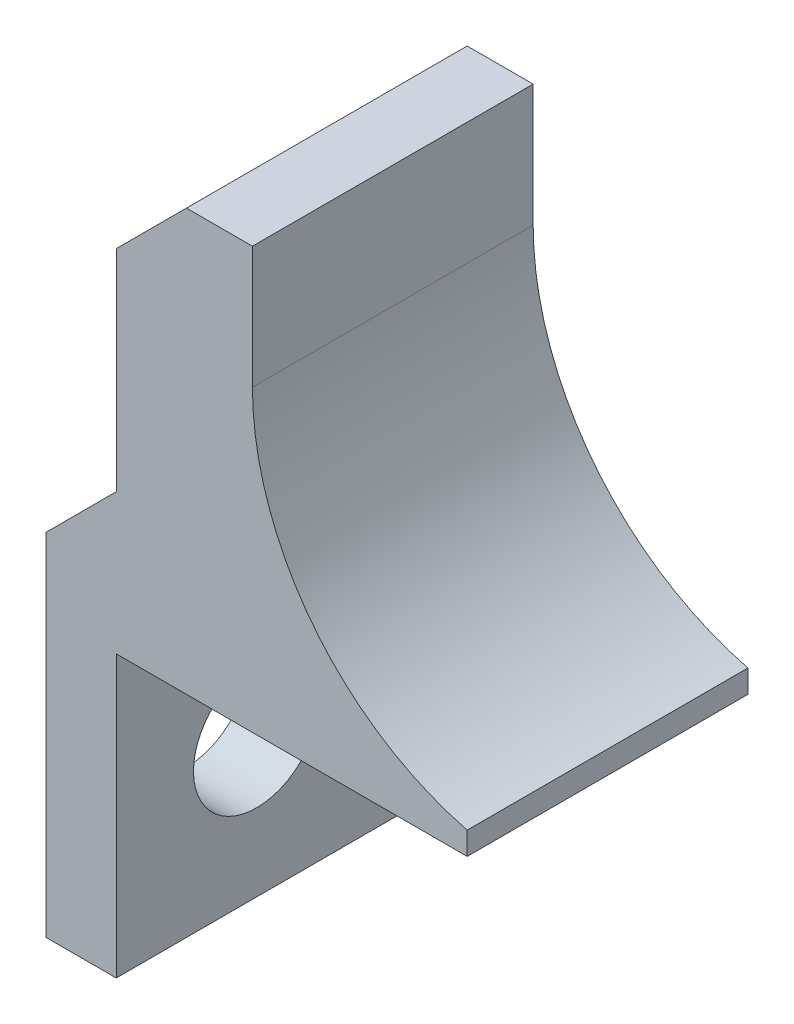
ISO-10303-21;
HEADER;
FILE_DESCRIPTION(('STEP AP214'),'2;1');
FILE_NAME('part.step','',(''),(''),'','','');
FILE_SCHEMA(('AUTOMOTIVE_DESIGN { 1 0 10303 214 1 1 1 1 }'));
ENDSEC;
DATA;
#1=APPLICATION_CONTEXT('core data for automotive mechanical design processes');
#2=APPLICATION_PROTOCOL_DEFINITION('international standard','automotive_design',2000,#1);
#3=PRODUCT_CONTEXT('',#1,'mechanical');
#4=PRODUCT('Part','Part','',(#3));
#5=PRODUCT_RELATED_PRODUCT_CATEGORY('part','',(#4));
#6=PRODUCT_DEFINITION_FORMATION('','',#4);
#7=PRODUCT_DEFINITION_CONTEXT('part definition',#1,'design');
#8=PRODUCT_DEFINITION('design','',#6,#7);
#9=PRODUCT_DEFINITION_SHAPE('','',#8);
#10=(LENGTH_UNIT() NAMED_UNIT(*) SI_UNIT(.MILLI.,.METRE.));
#11=(NAMED_UNIT(*) PLANE_ANGLE_UNIT() SI_UNIT($,.RADIAN.));
#12=(NAMED_UNIT(*) SI_UNIT($,.STERADIAN.) SOLID_ANGLE_UNIT());
#13=UNCERTAINTY_MEASURE_WITH_UNIT(LENGTH_MEASURE(1.E-05),#10,'distance_accuracy_value','');
#14=(GEOMETRIC_REPRESENTATION_CONTEXT(3) GLOBAL_UNCERTAINTY_ASSIGNED_CONTEXT((#13)) GLOBAL_UNIT_ASSIGNED_CONTEXT((#10,
#11,#12)) REPRESENTATION_CONTEXT('',''));
#15=CARTESIAN_POINT('',(0.,0.,0.));
#16=DIRECTION('',(0.,0.,1.));
#17=DIRECTION('',(1.,0.,0.));
#18=AXIS2_PLACEMENT_3D('',#15,#16,#17);
#19=CARTESIAN_POINT('',(0.,0.,20.));
#20=DIRECTION('',(-1.,0.,0.));
#21=DIRECTION('',(0.,0.,1.));
#22=AXIS2_PLACEMENT_3D('',#19,#20,#21);
#23=PLANE('',#22);
#24=CARTESIAN_POINT('',(0.,-10.,10.));
#25=DIRECTION('',(-1.,0.,0.));
#26=DIRECTION('',(0.,0.,1.));
#27=AXIS2_PLACEMENT_3D('',#24,#25,#26);
#28=CIRCLE('',#27,4.5);
#29=CARTESIAN_POINT('',(0.,-10.,14.5));
#30=VERTEX_POINT('',#29);
#31=EDGE_CURVE('E243',#30,#30,#28,.T.);
#32=ORIENTED_EDGE('',*,*,#31,.T.);
#33=EDGE_LOOP('',(#32));
#34=FACE_BOUND('',#33,.T.);
#35=DIRECTION('',(0.,1.,0.));
#36=VECTOR('',#35,1.);
#37=CARTESIAN_POINT('',(0.,0.,0.));
#38=LINE('',#37,#36);
#39=CARTESIAN_POINT('',(0.,-20.,0.));
#40=VERTEX_POINT('',#39);
#41=CARTESIAN_POINT('',(0.,0.,0.));
#42=VERTEX_POINT('',#41);
#43=EDGE_CURVE('E151',#40,#42,#38,.T.);
#44=ORIENTED_EDGE('',*,*,#43,.T.);
#45=DIRECTION('',(0.,0.,-1.));
#46=VECTOR('',#45,1.);
#47=CARTESIAN_POINT('',(0.,0.,20.));
#48=LINE('',#47,#46);
#49=CARTESIAN_POINT('',(0.,0.,20.));
#50=VERTEX_POINT('',#49);
#51=EDGE_CURVE('E130',#50,#42,#48,.T.);
#52=ORIENTED_EDGE('',*,*,#51,.F.);
#53=DIRECTION('',(0.,1.,0.));
#54=VECTOR('',#53,1.);
#55=CARTESIAN_POINT('',(0.,0.,20.));
#56=LINE('',#55,#54);
#57=CARTESIAN_POINT('',(0.,-20.,20.));
#58=VERTEX_POINT('',#57);
#59=EDGE_CURVE('E138',#58,#50,#56,.T.);
#60=ORIENTED_EDGE('',*,*,#59,.F.);
#61=DIRECTION('',(0.,0.,-1.));
#62=VECTOR('',#61,1.);
#63=CARTESIAN_POINT('',(0.,-20.,20.));
#64=LINE('',#63,#62);
#65=EDGE_CURVE('E200',#58,#40,#64,.T.);
#66=ORIENTED_EDGE('',*,*,#65,.T.);
#67=EDGE_LOOP('',(#44,#52,#60,#66));
#68=FACE_BOUND('',#67,.T.);
#69=ADVANCED_FACE('F41',(#34,#68),#23,.F.);
#70=CARTESIAN_POINT('',(6.25,0.,20.));
#71=DIRECTION('',(0.,1.,0.));
#72=DIRECTION('',(0.,0.,1.));
#73=AXIS2_PLACEMENT_3D('',#70,#71,#72);
#74=PLANE('',#73);
#75=DIRECTION('',(1.,0.,0.));
#76=VECTOR('',#75,1.);
#77=CARTESIAN_POINT('',(6.25,0.,0.));
#78=LINE('',#77,#76);
#79=CARTESIAN_POINT('',(25.,0.,0.));
#80=VERTEX_POINT('',#79);
#81=EDGE_CURVE('E236',#42,#80,#78,.T.);
#82=ORIENTED_EDGE('',*,*,#81,.T.);
#83=DIRECTION('',(0.,0.,-1.));
#84=VECTOR('',#83,1.);
#85=CARTESIAN_POINT('',(25.,0.,20.));
#86=LINE('',#85,#84);
#87=CARTESIAN_POINT('',(25.,0.,20.));
#88=VERTEX_POINT('',#87);
#89=EDGE_CURVE('E133',#88,#80,#86,.T.);
#90=ORIENTED_EDGE('',*,*,#89,.F.);
#91=DIRECTION('',(1.,0.,0.));
#92=VECTOR('',#91,1.);
#93=CARTESIAN_POINT('',(0.,0.,20.));
#94=LINE('',#93,#92);
#95=EDGE_CURVE('E126',#50,#88,#94,.T.);
#96=ORIENTED_EDGE('',*,*,#95,.F.);
#97=ORIENTED_EDGE('',*,*,#51,.T.);
#98=EDGE_LOOP('',(#82,#90,#96,#97));
#99=FACE_BOUND('',#98,.T.);
#100=ADVANCED_FACE('F128',(#99),#74,.F.);
#101=CARTESIAN_POINT('',(25.,0.,20.));
#102=DIRECTION('',(-1.,0.,0.));
#103=DIRECTION('',(0.,0.,1.));
#104=AXIS2_PLACEMENT_3D('',#101,#102,#103);
#105=PLANE('',#104);
#106=DIRECTION('',(0.,1.,0.));
#107=VECTOR('',#106,1.);
#108=CARTESIAN_POINT('',(25.,0.,0.));
#109=LINE('',#108,#107);
#110=CARTESIAN_POINT('',(25.,1.62539708151648,0.));
#111=VERTEX_POINT('',#110);
#112=EDGE_CURVE('E231',#80,#111,#109,.T.);
#113=ORIENTED_EDGE('',*,*,#112,.T.);
#114=DIRECTION('',(0.,0.,-1.));
#115=VECTOR('',#114,1.);
#116=CARTESIAN_POINT('',(25.,1.62539708151648,20.));
#117=LINE('',#116,#115);
#118=CARTESIAN_POINT('',(25.,1.62539708151648,20.));
#119=VERTEX_POINT('',#118);
#120=EDGE_CURVE('E160',#119,#111,#117,.T.);
#121=ORIENTED_EDGE('',*,*,#120,.F.);
#122=DIRECTION('',(0.,1.,0.));
#123=VECTOR('',#122,1.);
#124=CARTESIAN_POINT('',(25.,0.,20.));
#125=LINE('',#124,#123);
#126=EDGE_CURVE('E137',#88,#119,#125,.T.);
#127=ORIENTED_EDGE('',*,*,#126,.F.);
#128=ORIENTED_EDGE('',*,*,#89,.T.);
#129=EDGE_LOOP('',(#113,#121,#127,#128));
#130=FACE_BOUND('',#129,.T.);
#131=ADVANCED_FACE('F282',(#130),#105,.F.);
#132=CARTESIAN_POINT('',(30.,21.3,20.));
#133=DIRECTION('',(0.,0.,-1.));
#134=DIRECTION('',(-1.,0.,0.));
#135=AXIS2_PLACEMENT_3D('',#132,#133,#134);
#136=CYLINDRICAL_SURFACE('',#135,20.3);
#137=CARTESIAN_POINT('',(30.,21.3,0.));
#138=DIRECTION('',(0.,0.,-1.));
#139=DIRECTION('',(1.,0.,0.));
#140=AXIS2_PLACEMENT_3D('',#137,#138,#139);
#141=CIRCLE('',#140,20.3);
#142=CARTESIAN_POINT('',(9.69999999999999,21.3,0.));
#143=VERTEX_POINT('',#142);
#144=EDGE_CURVE('E226',#111,#143,#141,.T.);
#145=ORIENTED_EDGE('',*,*,#144,.T.);
#146=DIRECTION('',(0.,0.,-1.));
#147=VECTOR('',#146,1.);
#148=CARTESIAN_POINT('',(9.69999999999999,21.3,20.));
#149=LINE('',#148,#147);
#150=CARTESIAN_POINT('',(9.69999999999999,21.3,20.));
#151=VERTEX_POINT('',#150);
#152=EDGE_CURVE('E215',#151,#143,#149,.T.);
#153=ORIENTED_EDGE('',*,*,#152,.F.);
#154=CARTESIAN_POINT('',(30.,21.3,20.));
#155=DIRECTION('',(0.,0.,-1.));
#156=DIRECTION('',(1.,0.,0.));
#157=AXIS2_PLACEMENT_3D('',#154,#155,#156);
#158=CIRCLE('',#157,20.3);
#159=EDGE_CURVE('E227',#119,#151,#158,.T.);
#160=ORIENTED_EDGE('',*,*,#159,.F.);
#161=ORIENTED_EDGE('',*,*,#120,.T.);
#162=EDGE_LOOP('',(#145,#153,#160,#161));
#163=FACE_BOUND('',#162,.T.);
#164=ADVANCED_FACE('F224',(#163),#136,.F.);
#165=CARTESIAN_POINT('',(9.69999999999999,30.,20.));
#166=DIRECTION('',(-1.,0.,0.));
#167=DIRECTION('',(0.,0.,1.));
#168=AXIS2_PLACEMENT_3D('',#165,#166,#167);
#169=PLANE('',#168);
#170=DIRECTION('',(0.,1.,0.));
#171=VECTOR('',#170,1.);
#172=CARTESIAN_POINT('',(9.69999999999999,30.,0.));
#173=LINE('',#172,#171);
#174=CARTESIAN_POINT('',(9.69999999999999,30.,0.));
#175=VERTEX_POINT('',#174);
#176=EDGE_CURVE('E194',#143,#175,#173,.T.);
#177=ORIENTED_EDGE('',*,*,#176,.T.);
#178=DIRECTION('',(0.,0.,-1.));
#179=VECTOR('',#178,1.);
#180=CARTESIAN_POINT('',(9.69999999999999,30.,20.));
#181=LINE('',#180,#179);
#182=CARTESIAN_POINT('',(9.69999999999999,30.,20.));
#183=VERTEX_POINT('',#182);
#184=EDGE_CURVE('E211',#183,#175,#181,.T.);
#185=ORIENTED_EDGE('',*,*,#184,.F.);
#186=DIRECTION('',(0.,1.,0.));
#187=VECTOR('',#186,1.);
#188=CARTESIAN_POINT('',(9.69999999999999,30.,20.));
#189=LINE('',#188,#187);
#190=EDGE_CURVE('E254',#151,#183,#189,.T.);
#191=ORIENTED_EDGE('',*,*,#190,.F.);
#192=ORIENTED_EDGE('',*,*,#152,.T.);
#193=EDGE_LOOP('',(#177,#185,#191,#192));
#194=FACE_BOUND('',#193,.T.);
#195=ADVANCED_FACE('F286',(#194),#169,.F.);
#196=CARTESIAN_POINT('',(0.,30.,20.));
#197=DIRECTION('',(0.,-1.,0.));
#198=DIRECTION('',(0.,0.,-1.));
#199=AXIS2_PLACEMENT_3D('',#196,#197,#198);
#200=PLANE('',#199);
#201=DIRECTION('',(-1.,0.,0.));
#202=VECTOR('',#201,1.);
#203=CARTESIAN_POINT('',(0.,30.,0.));
#204=LINE('',#203,#202);
#205=CARTESIAN_POINT('',(5.00000000000001,30.,0.));
#206=VERTEX_POINT('',#205);
#207=EDGE_CURVE('E189',#175,#206,#204,.T.);
#208=ORIENTED_EDGE('',*,*,#207,.T.);
#209=DIRECTION('',(0.,0.,1.));
#210=VECTOR('',#209,1.);
#211=CARTESIAN_POINT('',(5.00000000000001,30.,20.));
#212=LINE('',#211,#210);
#213=CARTESIAN_POINT('',(5.00000000000001,30.,20.));
#214=VERTEX_POINT('',#213);
#215=EDGE_CURVE('E51',#206,#214,#212,.T.);
#216=ORIENTED_EDGE('',*,*,#215,.T.);
#217=DIRECTION('',(-1.,0.,0.));
#218=VECTOR('',#217,1.);
#219=CARTESIAN_POINT('',(0.,30.,20.));
#220=LINE('',#219,#218);
#221=EDGE_CURVE('E251',#183,#214,#220,.T.);
#222=ORIENTED_EDGE('',*,*,#221,.F.);
#223=ORIENTED_EDGE('',*,*,#184,.T.);
#224=EDGE_LOOP('',(#208,#216,#222,#223));
#225=FACE_BOUND('',#224,.T.);
#226=ADVANCED_FACE('F287',(#225),#200,.F.);
#227=CARTESIAN_POINT('',(0.,5.,20.));
#228=DIRECTION('',(1.,0.,0.));
#229=DIRECTION('',(0.,0.,-1.));
#230=AXIS2_PLACEMENT_3D('',#227,#228,#229);
#231=PLANE('',#230);
#232=DIRECTION('',(0.,-1.,0.));
#233=VECTOR('',#232,1.);
#234=CARTESIAN_POINT('',(0.,5.,20.));
#235=LINE('',#234,#233);
#236=CARTESIAN_POINT('',(0.,25.,20.));
#237=VERTEX_POINT('',#236);
#238=CARTESIAN_POINT('',(0.,9.99999999999998,20.));
#239=VERTEX_POINT('',#238);
#240=EDGE_CURVE('E181',#237,#239,#235,.T.);
#241=ORIENTED_EDGE('',*,*,#240,.F.);
#242=DIRECTION('',(0.,0.,-1.));
#243=VECTOR('',#242,1.);
#244=CARTESIAN_POINT('',(0.,25.,20.));
#245=LINE('',#244,#243);
#246=CARTESIAN_POINT('',(0.,25.,0.));
#247=VERTEX_POINT('',#246);
#248=EDGE_CURVE('E170',#237,#247,#245,.T.);
#249=ORIENTED_EDGE('',*,*,#248,.T.);
#250=DIRECTION('',(0.,-1.,0.));
#251=VECTOR('',#250,1.);
#252=CARTESIAN_POINT('',(0.,5.,0.));
#253=LINE('',#252,#251);
#254=CARTESIAN_POINT('',(0.,9.99999999999998,0.));
#255=VERTEX_POINT('',#254);
#256=EDGE_CURVE('E180',#247,#255,#253,.T.);
#257=ORIENTED_EDGE('',*,*,#256,.T.);
#258=DIRECTION('',(0.,0.,1.));
#259=VECTOR('',#258,1.);
#260=CARTESIAN_POINT('',(0.,9.99999999999998,20.));
#261=LINE('',#260,#259);
#262=EDGE_CURVE('E153',#255,#239,#261,.T.);
#263=ORIENTED_EDGE('',*,*,#262,.T.);
#264=EDGE_LOOP('',(#241,#249,#257,#263));
#265=FACE_BOUND('',#264,.T.);
#266=ADVANCED_FACE('F179',(#265),#231,.F.);
#267=CARTESIAN_POINT('',(-5.,-20.,20.));
#268=DIRECTION('',(1.,0.,0.));
#269=DIRECTION('',(0.,0.,-1.));
#270=AXIS2_PLACEMENT_3D('',#267,#268,#269);
#271=PLANE('',#270);
#272=CARTESIAN_POINT('',(-5.,-10.,10.));
#273=DIRECTION('',(-1.,0.,0.));
#274=DIRECTION('',(0.,0.,1.));
#275=AXIS2_PLACEMENT_3D('',#272,#273,#274);
#276=CIRCLE('',#275,4.5);
#277=CARTESIAN_POINT('',(-5.,-10.,14.5));
#278=VERTEX_POINT('',#277);
#279=EDGE_CURVE('E264',#278,#278,#276,.T.);
#280=ORIENTED_EDGE('',*,*,#279,.F.);
#281=EDGE_LOOP('',(#280));
#282=FACE_BOUND('',#281,.T.);
#283=DIRECTION('',(0.,-1.,0.));
#284=VECTOR('',#283,1.);
#285=CARTESIAN_POINT('',(-5.,-20.,0.));
#286=LINE('',#285,#284);
#287=CARTESIAN_POINT('',(-5.,5.,0.));
#288=VERTEX_POINT('',#287);
#289=CARTESIAN_POINT('',(-5.,-20.,0.));
#290=VERTEX_POINT('',#289);
#291=EDGE_CURVE('E188',#288,#290,#286,.T.);
#292=ORIENTED_EDGE('',*,*,#291,.T.);
#293=DIRECTION('',(0.,0.,-1.));
#294=VECTOR('',#293,1.);
#295=CARTESIAN_POINT('',(-5.,-20.,20.));
#296=LINE('',#295,#294);
#297=CARTESIAN_POINT('',(-5.,-20.,20.));
#298=VERTEX_POINT('',#297);
#299=EDGE_CURVE('E203',#298,#290,#296,.T.);
#300=ORIENTED_EDGE('',*,*,#299,.F.);
#301=DIRECTION('',(0.,-1.,0.));
#302=VECTOR('',#301,1.);
#303=CARTESIAN_POINT('',(-5.,-20.,20.));
#304=LINE('',#303,#302);
#305=CARTESIAN_POINT('',(-5.,5.,20.));
#306=VERTEX_POINT('',#305);
#307=EDGE_CURVE('E246',#306,#298,#304,.T.);
#308=ORIENTED_EDGE('',*,*,#307,.F.);
#309=DIRECTION('',(0.,0.,-1.));
#310=VECTOR('',#309,1.);
#311=CARTESIAN_POINT('',(-5.,5.,20.));
#312=LINE('',#311,#310);
#313=EDGE_CURVE('E207',#306,#288,#312,.T.);
#314=ORIENTED_EDGE('',*,*,#313,.T.);
#315=EDGE_LOOP('',(#292,#300,#308,#314));
#316=FACE_BOUND('',#315,.T.);
#317=ADVANCED_FACE('F272',(#282,#316),#271,.F.);
#318=CARTESIAN_POINT('',(0.,-20.,20.));
#319=DIRECTION('',(0.,1.,0.));
#320=DIRECTION('',(0.,0.,1.));
#321=AXIS2_PLACEMENT_3D('',#318,#319,#320);
#322=PLANE('',#321);
#323=DIRECTION('',(1.,0.,0.));
#324=VECTOR('',#323,1.);
#325=CARTESIAN_POINT('',(0.,-20.,0.));
#326=LINE('',#325,#324);
#327=EDGE_CURVE('E148',#290,#40,#326,.T.);
#328=ORIENTED_EDGE('',*,*,#327,.T.);
#329=ORIENTED_EDGE('',*,*,#65,.F.);
#330=DIRECTION('',(1.,0.,0.));
#331=VECTOR('',#330,1.);
#332=CARTESIAN_POINT('',(0.,-20.,20.));
#333=LINE('',#332,#331);
#334=EDGE_CURVE('E143',#298,#58,#333,.T.);
#335=ORIENTED_EDGE('',*,*,#334,.F.);
#336=ORIENTED_EDGE('',*,*,#299,.T.);
#337=EDGE_LOOP('',(#328,#329,#335,#336));
#338=FACE_BOUND('',#337,.T.);
#339=ADVANCED_FACE('F275',(#338),#322,.F.);
#340=CARTESIAN_POINT('',(30.,21.3,20.));
#341=DIRECTION('',(0.,0.,1.));
#342=DIRECTION('',(1.,0.,0.));
#343=AXIS2_PLACEMENT_3D('',#340,#341,#342);
#344=PLANE('',#343);
#345=ORIENTED_EDGE('',*,*,#221,.T.);
#346=DIRECTION('',(0.707106781186549,0.707106781186547,0.));
#347=VECTOR('',#346,1.);
#348=CARTESIAN_POINT('',(13.15,38.15,20.));
#349=LINE('',#348,#347);
#350=EDGE_CURVE('E11',#214,#237,#349,.F.);
#351=ORIENTED_EDGE('',*,*,#350,.T.);
#352=ORIENTED_EDGE('',*,*,#240,.T.);
#353=DIRECTION('',(0.707106781186549,0.707106781186546,0.));
#354=VECTOR('',#353,1.);
#355=CARTESIAN_POINT('',(-5.,5.,20.));
#356=LINE('',#355,#354);
#357=EDGE_CURVE('E167',#239,#306,#356,.F.);
#358=ORIENTED_EDGE('',*,*,#357,.T.);
#359=ORIENTED_EDGE('',*,*,#307,.T.);
#360=ORIENTED_EDGE('',*,*,#334,.T.);
#361=ORIENTED_EDGE('',*,*,#59,.T.);
#362=ORIENTED_EDGE('',*,*,#95,.T.);
#363=ORIENTED_EDGE('',*,*,#126,.T.);
#364=ORIENTED_EDGE('',*,*,#159,.T.);
#365=ORIENTED_EDGE('',*,*,#190,.T.);
#366=EDGE_LOOP('',(#345,#351,#352,#358,#359,#360,#361,#362,#363,#364,#365));
#367=FACE_BOUND('',#366,.T.);
#368=ADVANCED_FACE('F141',(#367),#344,.T.);
#369=CARTESIAN_POINT('',(30.,21.3,0.));
#370=DIRECTION('',(0.,0.,1.));
#371=DIRECTION('',(1.,0.,0.));
#372=AXIS2_PLACEMENT_3D('',#369,#370,#371);
#373=PLANE('',#372);
#374=ORIENTED_EDGE('',*,*,#256,.F.);
#375=DIRECTION('',(-0.707106781186549,-0.707106781186547,0.));
#376=VECTOR('',#375,1.);
#377=CARTESIAN_POINT('',(0.,25.,0.));
#378=LINE('',#377,#376);
#379=EDGE_CURVE('E65',#247,#206,#378,.F.);
#380=ORIENTED_EDGE('',*,*,#379,.T.);
#381=ORIENTED_EDGE('',*,*,#207,.F.);
#382=ORIENTED_EDGE('',*,*,#176,.F.);
#383=ORIENTED_EDGE('',*,*,#144,.F.);
#384=ORIENTED_EDGE('',*,*,#112,.F.);
#385=ORIENTED_EDGE('',*,*,#81,.F.);
#386=ORIENTED_EDGE('',*,*,#43,.F.);
#387=ORIENTED_EDGE('',*,*,#327,.F.);
#388=ORIENTED_EDGE('',*,*,#291,.F.);
#389=DIRECTION('',(-0.707106781186549,-0.707106781186546,0.));
#390=VECTOR('',#389,1.);
#391=CARTESIAN_POINT('',(20.6500000000001,30.65,0.));
#392=LINE('',#391,#390);
#393=EDGE_CURVE('E158',#288,#255,#392,.F.);
#394=ORIENTED_EDGE('',*,*,#393,.T.);
#395=EDGE_LOOP('',(#374,#380,#381,#382,#383,#384,#385,#386,#387,#388,#394));
#396=FACE_BOUND('',#395,.T.);
#397=ADVANCED_FACE('F184',(#396),#373,.F.);
#398=CARTESIAN_POINT('',(15.,-10.,10.));
#399=DIRECTION('',(-1.,0.,0.));
#400=DIRECTION('',(0.,0.,1.));
#401=AXIS2_PLACEMENT_3D('',#398,#399,#400);
#402=CYLINDRICAL_SURFACE('',#401,4.5);
#403=ORIENTED_EDGE('',*,*,#279,.T.);
#404=EDGE_LOOP('',(#403));
#405=FACE_BOUND('',#404,.T.);
#406=ORIENTED_EDGE('',*,*,#31,.F.);
#407=EDGE_LOOP('',(#406));
#408=FACE_BOUND('',#407,.T.);
#409=ADVANCED_FACE('F269',(#405,#408),#402,.F.);
#410=CARTESIAN_POINT('',(-5.,5.,20.));
#411=DIRECTION('',(-0.707106781186546,0.707106781186549,0.));
#412=DIRECTION('',(0.,0.,1.));
#413=AXIS2_PLACEMENT_3D('',#410,#411,#412);
#414=PLANE('',#413);
#415=ORIENTED_EDGE('',*,*,#357,.F.);
#416=ORIENTED_EDGE('',*,*,#262,.F.);
#417=ORIENTED_EDGE('',*,*,#393,.F.);
#418=ORIENTED_EDGE('',*,*,#313,.F.);
#419=EDGE_LOOP('',(#415,#416,#417,#418));
#420=FACE_BOUND('',#419,.T.);
#421=ADVANCED_FACE('F289',(#420),#414,.T.);
#422=CARTESIAN_POINT('',(0.,25.,20.));
#423=DIRECTION('',(0.707106781186546,-0.707106781186548,0.));
#424=DIRECTION('',(0.,0.,-1.));
#425=AXIS2_PLACEMENT_3D('',#422,#423,#424);
#426=PLANE('',#425);
#427=ORIENTED_EDGE('',*,*,#350,.F.);
#428=ORIENTED_EDGE('',*,*,#215,.F.);
#429=ORIENTED_EDGE('',*,*,#379,.F.);
#430=ORIENTED_EDGE('',*,*,#248,.F.);
#431=EDGE_LOOP('',(#427,#428,#429,#430));
#432=FACE_BOUND('',#431,.T.);
#433=ADVANCED_FACE('F44',(#432),#426,.F.);
#434=CLOSED_SHELL('',(#69,#100,#131,#164,#195,#226,#266,#317,#339,#368,#397,#409,#421,#433));
#435=MANIFOLD_SOLID_BREP('B2',#434);
#436=ADVANCED_BREP_SHAPE_REPRESENTATION('',(#18,#435),#14);
#437=SHAPE_DEFINITION_REPRESENTATION(#9,#436);
ENDSEC;
END-ISO-10303-21;
